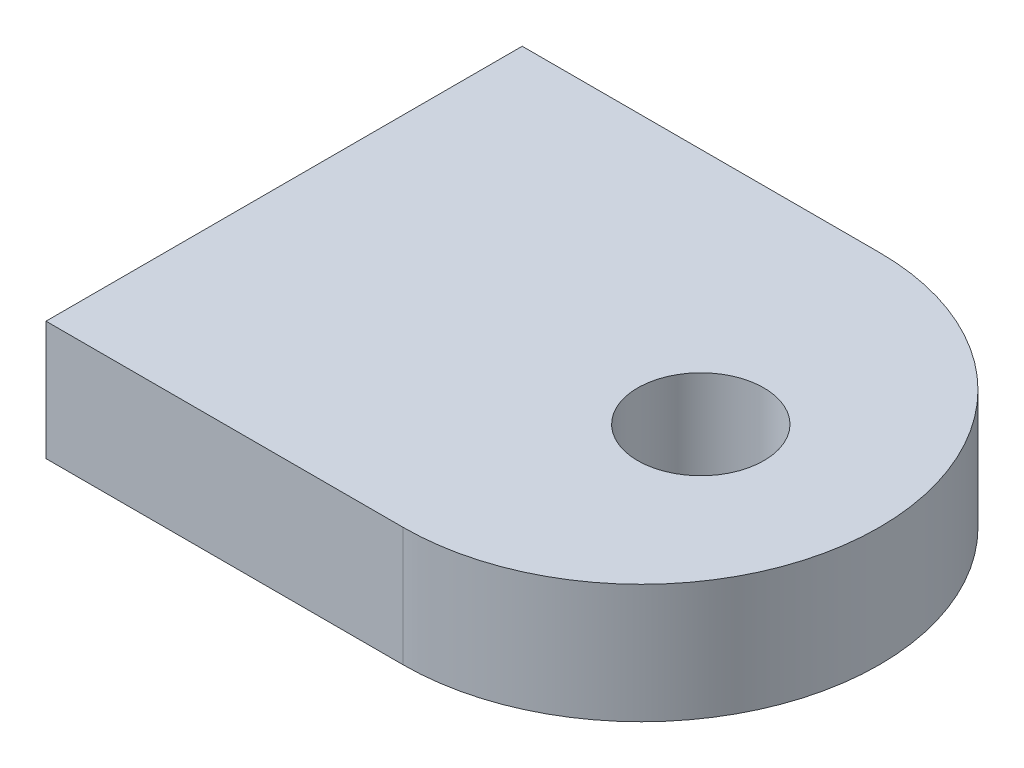
ISO-10303-21;
HEADER;
FILE_DESCRIPTION(('STEP AP214'),'2;1');
FILE_NAME('part.step','',(''),(''),'','','');
FILE_SCHEMA(('AUTOMOTIVE_DESIGN { 1 0 10303 214 1 1 1 1 }'));
ENDSEC;
DATA;
#1=APPLICATION_CONTEXT('core data for automotive mechanical design processes');
#2=APPLICATION_PROTOCOL_DEFINITION('international standard','automotive_design',2000,#1);
#3=PRODUCT_CONTEXT('',#1,'mechanical');
#4=PRODUCT('Part','Part','',(#3));
#5=PRODUCT_RELATED_PRODUCT_CATEGORY('part','',(#4));
#6=PRODUCT_DEFINITION_FORMATION('','',#4);
#7=PRODUCT_DEFINITION_CONTEXT('part definition',#1,'design');
#8=PRODUCT_DEFINITION('design','',#6,#7);
#9=PRODUCT_DEFINITION_SHAPE('','',#8);
#10=(LENGTH_UNIT() NAMED_UNIT(*) SI_UNIT(.MILLI.,.METRE.));
#11=(NAMED_UNIT(*) PLANE_ANGLE_UNIT() SI_UNIT($,.RADIAN.));
#12=(NAMED_UNIT(*) SI_UNIT($,.STERADIAN.) SOLID_ANGLE_UNIT());
#13=UNCERTAINTY_MEASURE_WITH_UNIT(LENGTH_MEASURE(1.E-05),#10,'distance_accuracy_value','');
#14=(GEOMETRIC_REPRESENTATION_CONTEXT(3) GLOBAL_UNCERTAINTY_ASSIGNED_CONTEXT((#13)) GLOBAL_UNIT_ASSIGNED_CONTEXT((#10,
#11,#12)) REPRESENTATION_CONTEXT('',''));
#15=CARTESIAN_POINT('',(0.,0.,0.));
#16=DIRECTION('',(0.,0.,1.));
#17=DIRECTION('',(1.,0.,0.));
#18=AXIS2_PLACEMENT_3D('',#15,#16,#17);
#19=CARTESIAN_POINT('',(0.,0.,0.));
#20=DIRECTION('',(0.,1.,0.));
#21=DIRECTION('',(0.,0.,1.));
#22=AXIS2_PLACEMENT_3D('',#19,#20,#21);
#23=PLANE('',#22);
#24=CARTESIAN_POINT('',(22.225,0.,0.));
#25=DIRECTION('',(0.,1.,0.));
#26=DIRECTION('',(0.,0.,1.));
#27=AXIS2_PLACEMENT_3D('',#24,#25,#26);
#28=CIRCLE('',#27,3.3655);
#29=CARTESIAN_POINT('',(22.225,0.,3.3655));
#30=VERTEX_POINT('',#29);
#31=EDGE_CURVE('E82',#30,#30,#28,.T.);
#32=ORIENTED_EDGE('',*,*,#31,.T.);
#33=EDGE_LOOP('',(#32));
#34=FACE_BOUND('',#33,.T.);
#35=DIRECTION('',(0.,0.,1.));
#36=VECTOR('',#35,1.);
#37=CARTESIAN_POINT('',(0.,0.,-12.7));
#38=LINE('',#37,#36);
#39=CARTESIAN_POINT('',(0.,0.,-12.7));
#40=VERTEX_POINT('',#39);
#41=CARTESIAN_POINT('',(0.,0.,12.7));
#42=VERTEX_POINT('',#41);
#43=EDGE_CURVE('E60',#40,#42,#38,.T.);
#44=ORIENTED_EDGE('',*,*,#43,.F.);
#45=DIRECTION('',(-1.,0.,0.));
#46=VECTOR('',#45,1.);
#47=CARTESIAN_POINT('',(31.75,0.,-12.7));
#48=LINE('',#47,#46);
#49=CARTESIAN_POINT('',(19.05,0.,-12.7));
#50=VERTEX_POINT('',#49);
#51=EDGE_CURVE('E49',#50,#40,#48,.T.);
#52=ORIENTED_EDGE('',*,*,#51,.F.);
#53=CARTESIAN_POINT('',(19.05,0.,0.));
#54=DIRECTION('',(0.,-1.,0.));
#55=DIRECTION('',(0.,0.,-1.));
#56=AXIS2_PLACEMENT_3D('',#53,#54,#55);
#57=CIRCLE('',#56,12.7);
#58=CARTESIAN_POINT('',(19.05,0.,12.7));
#59=VERTEX_POINT('',#58);
#60=EDGE_CURVE('E20',#59,#50,#57,.F.);
#61=ORIENTED_EDGE('',*,*,#60,.F.);
#62=DIRECTION('',(1.,0.,0.));
#63=VECTOR('',#62,1.);
#64=CARTESIAN_POINT('',(0.,0.,12.7));
#65=LINE('',#64,#63);
#66=EDGE_CURVE('E94',#42,#59,#65,.T.);
#67=ORIENTED_EDGE('',*,*,#66,.F.);
#68=EDGE_LOOP('',(#44,#52,#61,#67));
#69=FACE_BOUND('',#68,.T.);
#70=ADVANCED_FACE('F17',(#34,#69),#23,.F.);
#71=CARTESIAN_POINT('',(31.75,0.,-12.7));
#72=DIRECTION('',(0.,0.,-1.));
#73=DIRECTION('',(-1.,0.,0.));
#74=AXIS2_PLACEMENT_3D('',#71,#72,#73);
#75=PLANE('',#74);
#76=DIRECTION('',(1.,0.,0.));
#77=VECTOR('',#76,1.);
#78=CARTESIAN_POINT('',(0.,6.35,-12.7));
#79=LINE('',#78,#77);
#80=CARTESIAN_POINT('',(19.05,6.35,-12.7));
#81=VERTEX_POINT('',#80);
#82=CARTESIAN_POINT('',(0.,6.35,-12.7));
#83=VERTEX_POINT('',#82);
#84=EDGE_CURVE('E69',#81,#83,#79,.F.);
#85=ORIENTED_EDGE('',*,*,#84,.F.);
#86=DIRECTION('',(0.,-1.,0.));
#87=VECTOR('',#86,1.);
#88=CARTESIAN_POINT('',(19.05,22.2631,-12.7));
#89=LINE('',#88,#87);
#90=EDGE_CURVE('E85',#50,#81,#89,.F.);
#91=ORIENTED_EDGE('',*,*,#90,.F.);
#92=ORIENTED_EDGE('',*,*,#51,.T.);
#93=DIRECTION('',(0.,1.,0.));
#94=VECTOR('',#93,1.);
#95=CARTESIAN_POINT('',(0.,0.,-12.7));
#96=LINE('',#95,#94);
#97=EDGE_CURVE('E65',#83,#40,#96,.F.);
#98=ORIENTED_EDGE('',*,*,#97,.F.);
#99=EDGE_LOOP('',(#85,#91,#92,#98));
#100=FACE_BOUND('',#99,.T.);
#101=ADVANCED_FACE('F67',(#100),#75,.T.);
#102=CARTESIAN_POINT('',(0.,0.,-12.7));
#103=DIRECTION('',(-1.,0.,0.));
#104=DIRECTION('',(0.,0.,1.));
#105=AXIS2_PLACEMENT_3D('',#102,#103,#104);
#106=PLANE('',#105);
#107=ORIENTED_EDGE('',*,*,#97,.T.);
#108=ORIENTED_EDGE('',*,*,#43,.T.);
#109=DIRECTION('',(0.,1.,0.));
#110=VECTOR('',#109,1.);
#111=CARTESIAN_POINT('',(0.,0.,12.7));
#112=LINE('',#111,#110);
#113=CARTESIAN_POINT('',(0.,6.35,12.7));
#114=VERTEX_POINT('',#113);
#115=EDGE_CURVE('E76',#114,#42,#112,.F.);
#116=ORIENTED_EDGE('',*,*,#115,.F.);
#117=DIRECTION('',(0.,0.,1.));
#118=VECTOR('',#117,1.);
#119=CARTESIAN_POINT('',(0.,6.35,0.));
#120=LINE('',#119,#118);
#121=EDGE_CURVE('E73',#83,#114,#120,.T.);
#122=ORIENTED_EDGE('',*,*,#121,.F.);
#123=EDGE_LOOP('',(#107,#108,#116,#122));
#124=FACE_BOUND('',#123,.T.);
#125=ADVANCED_FACE('F74',(#124),#106,.T.);
#126=CARTESIAN_POINT('',(0.,0.,12.7));
#127=DIRECTION('',(0.,0.,1.));
#128=DIRECTION('',(1.,0.,0.));
#129=AXIS2_PLACEMENT_3D('',#126,#127,#128);
#130=PLANE('',#129);
#131=ORIENTED_EDGE('',*,*,#66,.T.);
#132=DIRECTION('',(0.,-1.,0.));
#133=VECTOR('',#132,1.);
#134=CARTESIAN_POINT('',(19.05,22.2631,12.7));
#135=LINE('',#134,#133);
#136=CARTESIAN_POINT('',(19.05,6.35,12.7));
#137=VERTEX_POINT('',#136);
#138=EDGE_CURVE('E35',#137,#59,#135,.T.);
#139=ORIENTED_EDGE('',*,*,#138,.F.);
#140=DIRECTION('',(1.,0.,0.));
#141=VECTOR('',#140,1.);
#142=CARTESIAN_POINT('',(0.,6.35,12.7));
#143=LINE('',#142,#141);
#144=EDGE_CURVE('E79',#114,#137,#143,.T.);
#145=ORIENTED_EDGE('',*,*,#144,.F.);
#146=ORIENTED_EDGE('',*,*,#115,.T.);
#147=EDGE_LOOP('',(#131,#139,#145,#146));
#148=FACE_BOUND('',#147,.T.);
#149=ADVANCED_FACE('F111',(#148),#130,.T.);
#150=CARTESIAN_POINT('',(19.05,22.2631,0.));
#151=DIRECTION('',(0.,-1.,0.));
#152=DIRECTION('',(0.,0.,-1.));
#153=AXIS2_PLACEMENT_3D('',#150,#151,#152);
#154=CYLINDRICAL_SURFACE('',#153,12.7);
#155=ORIENTED_EDGE('',*,*,#90,.T.);
#156=CARTESIAN_POINT('',(19.05,6.35,0.));
#157=DIRECTION('',(0.,-1.,0.));
#158=DIRECTION('',(0.,0.,-1.));
#159=AXIS2_PLACEMENT_3D('',#156,#157,#158);
#160=CIRCLE('',#159,12.7);
#161=EDGE_CURVE('E26',#137,#81,#160,.F.);
#162=ORIENTED_EDGE('',*,*,#161,.F.);
#163=ORIENTED_EDGE('',*,*,#138,.T.);
#164=ORIENTED_EDGE('',*,*,#60,.T.);
#165=EDGE_LOOP('',(#155,#162,#163,#164));
#166=FACE_BOUND('',#165,.T.);
#167=ADVANCED_FACE('F113',(#166),#154,.T.);
#168=CARTESIAN_POINT('',(22.225,0.,0.));
#169=DIRECTION('',(0.,1.,0.));
#170=DIRECTION('',(0.,0.,1.));
#171=AXIS2_PLACEMENT_3D('',#168,#169,#170);
#172=CYLINDRICAL_SURFACE('',#171,3.3655);
#173=CARTESIAN_POINT('',(22.225,6.35,0.));
#174=DIRECTION('',(0.,1.,0.));
#175=DIRECTION('',(0.,0.,1.));
#176=AXIS2_PLACEMENT_3D('',#173,#174,#175);
#177=CIRCLE('',#176,3.3655);
#178=CARTESIAN_POINT('',(22.225,6.35,3.3655));
#179=VERTEX_POINT('',#178);
#180=EDGE_CURVE('E11',#179,#179,#177,.F.);
#181=ORIENTED_EDGE('',*,*,#180,.F.);
#182=EDGE_LOOP('',(#181));
#183=FACE_BOUND('',#182,.T.);
#184=ORIENTED_EDGE('',*,*,#31,.F.);
#185=EDGE_LOOP('',(#184));
#186=FACE_BOUND('',#185,.T.);
#187=ADVANCED_FACE('F115',(#183,#186),#172,.F.);
#188=CARTESIAN_POINT('',(0.,6.35,0.));
#189=DIRECTION('',(0.,1.,0.));
#190=DIRECTION('',(0.,0.,1.));
#191=AXIS2_PLACEMENT_3D('',#188,#189,#190);
#192=PLANE('',#191);
#193=ORIENTED_EDGE('',*,*,#180,.T.);
#194=EDGE_LOOP('',(#193));
#195=FACE_BOUND('',#194,.T.);
#196=ORIENTED_EDGE('',*,*,#161,.T.);
#197=ORIENTED_EDGE('',*,*,#84,.T.);
#198=ORIENTED_EDGE('',*,*,#121,.T.);
#199=ORIENTED_EDGE('',*,*,#144,.T.);
#200=EDGE_LOOP('',(#196,#197,#198,#199));
#201=FACE_BOUND('',#200,.T.);
#202=ADVANCED_FACE('F81',(#195,#201),#192,.T.);
#203=CLOSED_SHELL('',(#70,#101,#125,#149,#167,#187,#202));
#204=MANIFOLD_SOLID_BREP('B1',#203);
#205=ADVANCED_BREP_SHAPE_REPRESENTATION('',(#18,#204),#14);
#206=SHAPE_DEFINITION_REPRESENTATION(#9,#205);
ENDSEC;
END-ISO-10303-21;
